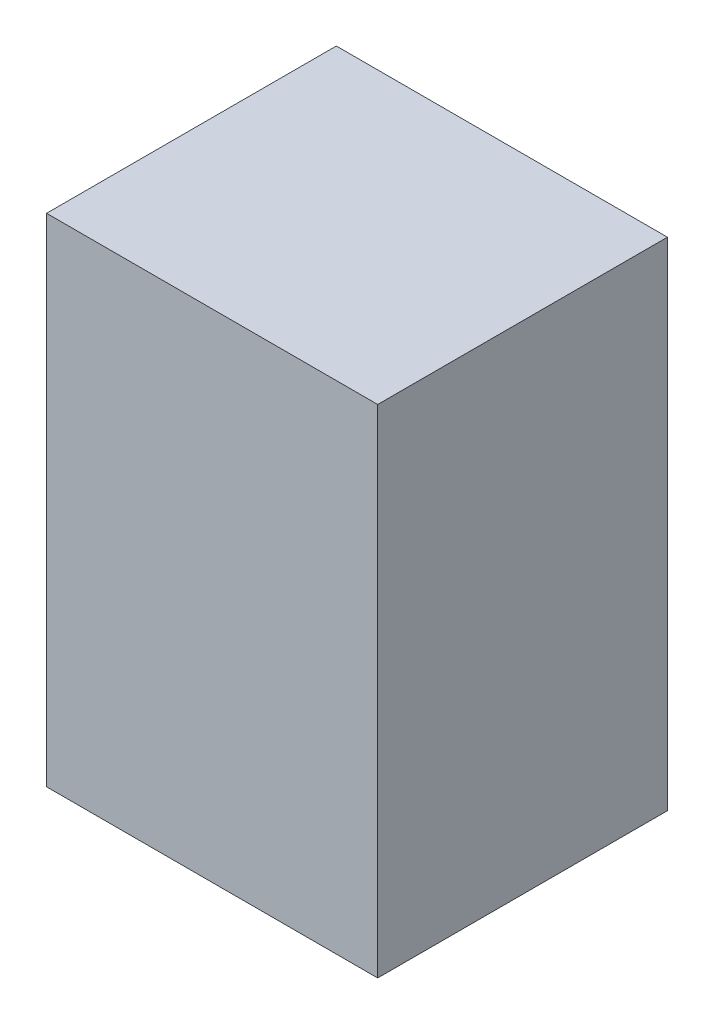
ISO-10303-21;
HEADER;
FILE_DESCRIPTION(('STEP AP214'),'2;1');
FILE_NAME('part.step','',(''),(''),'','','');
FILE_SCHEMA(('AUTOMOTIVE_DESIGN { 1 0 10303 214 1 1 1 1 }'));
ENDSEC;
DATA;
#1=APPLICATION_CONTEXT('core data for automotive mechanical design processes');
#2=APPLICATION_PROTOCOL_DEFINITION('international standard','automotive_design',2000,#1);
#3=PRODUCT_CONTEXT('',#1,'mechanical');
#4=PRODUCT('Part','Part','',(#3));
#5=PRODUCT_RELATED_PRODUCT_CATEGORY('part','',(#4));
#6=PRODUCT_DEFINITION_FORMATION('','',#4);
#7=PRODUCT_DEFINITION_CONTEXT('part definition',#1,'design');
#8=PRODUCT_DEFINITION('design','',#6,#7);
#9=PRODUCT_DEFINITION_SHAPE('','',#8);
#10=(LENGTH_UNIT() NAMED_UNIT(*) SI_UNIT(.MILLI.,.METRE.));
#11=(NAMED_UNIT(*) PLANE_ANGLE_UNIT() SI_UNIT($,.RADIAN.));
#12=(NAMED_UNIT(*) SI_UNIT($,.STERADIAN.) SOLID_ANGLE_UNIT());
#13=UNCERTAINTY_MEASURE_WITH_UNIT(LENGTH_MEASURE(1.E-05),#10,'distance_accuracy_value','');
#14=(GEOMETRIC_REPRESENTATION_CONTEXT(3) GLOBAL_UNCERTAINTY_ASSIGNED_CONTEXT((#13)) GLOBAL_UNIT_ASSIGNED_CONTEXT((#10,
#11,#12)) REPRESENTATION_CONTEXT('',''));
#15=CARTESIAN_POINT('',(0.,0.,0.));
#16=DIRECTION('',(0.,0.,1.));
#17=DIRECTION('',(1.,0.,0.));
#18=AXIS2_PLACEMENT_3D('',#15,#16,#17);
#19=CARTESIAN_POINT('',(-14.00000066,3.99999934,-1.611602167724));
#20=DIRECTION('',(0.,0.,1.));
#21=DIRECTION('',(1.,0.,0.));
#22=AXIS2_PLACEMENT_3D('',#19,#20,#21);
#23=PLANE('',#22);
#24=DIRECTION('',(0.,1.,0.));
#25=VECTOR('',#24,1.);
#26=CARTESIAN_POINT('',(-14.39999986,4.59999814,-1.611602167724));
#27=LINE('',#26,#25);
#28=CARTESIAN_POINT('',(-14.39999986,4.59999814,-1.611602167724));
#29=VERTEX_POINT('',#28);
#30=CARTESIAN_POINT('',(-14.39999986,3.40000054,-1.611602167724));
#31=VERTEX_POINT('',#30);
#32=EDGE_CURVE('E76',#29,#31,#27,.F.);
#33=ORIENTED_EDGE('',*,*,#32,.T.);
#34=DIRECTION('',(1.,0.,0.));
#35=VECTOR('',#34,1.);
#36=CARTESIAN_POINT('',(-14.39999986,3.40000054,-1.611602167724));
#37=LINE('',#36,#35);
#38=CARTESIAN_POINT('',(-13.60000146,3.40000054,-1.611602167724));
#39=VERTEX_POINT('',#38);
#40=EDGE_CURVE('E58',#31,#39,#37,.T.);
#41=ORIENTED_EDGE('',*,*,#40,.T.);
#42=DIRECTION('',(0.,1.,0.));
#43=VECTOR('',#42,1.);
#44=CARTESIAN_POINT('',(-13.60000146,3.40000054,-1.611602167724));
#45=LINE('',#44,#43);
#46=CARTESIAN_POINT('',(-13.60000146,4.59999814,-1.611602167724));
#47=VERTEX_POINT('',#46);
#48=EDGE_CURVE('E20',#39,#47,#45,.T.);
#49=ORIENTED_EDGE('',*,*,#48,.T.);
#50=DIRECTION('',(1.,0.,0.));
#51=VECTOR('',#50,1.);
#52=CARTESIAN_POINT('',(-13.60000146,4.59999814,-1.611602167724));
#53=LINE('',#52,#51);
#54=EDGE_CURVE('E55',#47,#29,#53,.F.);
#55=ORIENTED_EDGE('',*,*,#54,.T.);
#56=EDGE_LOOP('',(#33,#41,#49,#55));
#57=FACE_BOUND('',#56,.T.);
#58=ADVANCED_FACE('F17',(#57),#23,.T.);
#59=CARTESIAN_POINT('',(-13.60000146,3.40000054,-2.311603307724));
#60=DIRECTION('',(-1.,0.,0.));
#61=DIRECTION('',(0.,0.,1.));
#62=AXIS2_PLACEMENT_3D('',#59,#60,#61);
#63=PLANE('',#62);
#64=DIRECTION('',(0.,0.,-1.));
#65=VECTOR('',#64,1.);
#66=CARTESIAN_POINT('',(-13.60000146,4.59999814,-2.311603307724));
#67=LINE('',#66,#65);
#68=CARTESIAN_POINT('',(-13.60000146,4.59999814,-2.311603307724));
#69=VERTEX_POINT('',#68);
#70=EDGE_CURVE('E63',#69,#47,#67,.F.);
#71=ORIENTED_EDGE('',*,*,#70,.T.);
#72=ORIENTED_EDGE('',*,*,#48,.F.);
#73=DIRECTION('',(0.,0.,1.));
#74=VECTOR('',#73,1.);
#75=CARTESIAN_POINT('',(-13.60000146,3.40000054,-2.311603307724));
#76=LINE('',#75,#74);
#77=CARTESIAN_POINT('',(-13.60000146,3.40000054,-2.311603307724));
#78=VERTEX_POINT('',#77);
#79=EDGE_CURVE('E80',#39,#78,#76,.F.);
#80=ORIENTED_EDGE('',*,*,#79,.T.);
#81=DIRECTION('',(0.,1.,0.));
#82=VECTOR('',#81,1.);
#83=CARTESIAN_POINT('',(-13.60000146,3.99999934,-2.311603307724));
#84=LINE('',#83,#82);
#85=EDGE_CURVE('E73',#78,#69,#84,.T.);
#86=ORIENTED_EDGE('',*,*,#85,.T.);
#87=EDGE_LOOP('',(#71,#72,#80,#86));
#88=FACE_BOUND('',#87,.T.);
#89=ADVANCED_FACE('F72',(#88),#63,.F.);
#90=CARTESIAN_POINT('',(-13.60000146,4.59999814,-2.311603307724));
#91=DIRECTION('',(0.,-1.,0.));
#92=DIRECTION('',(0.,0.,-1.));
#93=AXIS2_PLACEMENT_3D('',#90,#91,#92);
#94=PLANE('',#93);
#95=DIRECTION('',(0.,0.,-1.));
#96=VECTOR('',#95,1.);
#97=CARTESIAN_POINT('',(-14.39999986,4.59999814,-2.311603307724));
#98=LINE('',#97,#96);
#99=CARTESIAN_POINT('',(-14.39999986,4.59999814,-2.311603307724));
#100=VERTEX_POINT('',#99);
#101=EDGE_CURVE('E69',#100,#29,#98,.F.);
#102=ORIENTED_EDGE('',*,*,#101,.T.);
#103=ORIENTED_EDGE('',*,*,#54,.F.);
#104=ORIENTED_EDGE('',*,*,#70,.F.);
#105=DIRECTION('',(1.,0.,0.));
#106=VECTOR('',#105,1.);
#107=CARTESIAN_POINT('',(-14.00000066,4.59999814,-2.311603307724));
#108=LINE('',#107,#106);
#109=EDGE_CURVE('E83',#69,#100,#108,.F.);
#110=ORIENTED_EDGE('',*,*,#109,.T.);
#111=EDGE_LOOP('',(#102,#103,#104,#110));
#112=FACE_BOUND('',#111,.T.);
#113=ADVANCED_FACE('F66',(#112),#94,.F.);
#114=CARTESIAN_POINT('',(-14.39999986,4.59999814,-2.311603307724));
#115=DIRECTION('',(1.,0.,0.));
#116=DIRECTION('',(0.,0.,-1.));
#117=AXIS2_PLACEMENT_3D('',#114,#115,#116);
#118=PLANE('',#117);
#119=DIRECTION('',(0.,0.,1.));
#120=VECTOR('',#119,1.);
#121=CARTESIAN_POINT('',(-14.39999986,3.40000054,-2.311603307724));
#122=LINE('',#121,#120);
#123=CARTESIAN_POINT('',(-14.39999986,3.40000054,-2.311603307724));
#124=VERTEX_POINT('',#123);
#125=EDGE_CURVE('E34',#124,#31,#122,.T.);
#126=ORIENTED_EDGE('',*,*,#125,.T.);
#127=ORIENTED_EDGE('',*,*,#32,.F.);
#128=ORIENTED_EDGE('',*,*,#101,.F.);
#129=DIRECTION('',(0.,1.,0.));
#130=VECTOR('',#129,1.);
#131=CARTESIAN_POINT('',(-14.39999986,3.99999934,-2.311603307724));
#132=LINE('',#131,#130);
#133=EDGE_CURVE('E26',#100,#124,#132,.F.);
#134=ORIENTED_EDGE('',*,*,#133,.T.);
#135=EDGE_LOOP('',(#126,#127,#128,#134));
#136=FACE_BOUND('',#135,.T.);
#137=ADVANCED_FACE('F88',(#136),#118,.F.);
#138=CARTESIAN_POINT('',(-14.39999986,3.40000054,-2.311603307724));
#139=DIRECTION('',(0.,1.,0.));
#140=DIRECTION('',(0.,0.,1.));
#141=AXIS2_PLACEMENT_3D('',#138,#139,#140);
#142=PLANE('',#141);
#143=ORIENTED_EDGE('',*,*,#79,.F.);
#144=ORIENTED_EDGE('',*,*,#40,.F.);
#145=ORIENTED_EDGE('',*,*,#125,.F.);
#146=DIRECTION('',(1.,0.,0.));
#147=VECTOR('',#146,1.);
#148=CARTESIAN_POINT('',(-14.00000066,3.40000054,-2.311603307724));
#149=LINE('',#148,#147);
#150=EDGE_CURVE('E11',#124,#78,#149,.T.);
#151=ORIENTED_EDGE('',*,*,#150,.T.);
#152=EDGE_LOOP('',(#143,#144,#145,#151));
#153=FACE_BOUND('',#152,.T.);
#154=ADVANCED_FACE('F91',(#153),#142,.F.);
#155=CARTESIAN_POINT('',(-14.00000066,3.99999934,-2.311603307724));
#156=DIRECTION('',(0.,0.,1.));
#157=DIRECTION('',(1.,0.,0.));
#158=AXIS2_PLACEMENT_3D('',#155,#156,#157);
#159=PLANE('',#158);
#160=ORIENTED_EDGE('',*,*,#133,.F.);
#161=ORIENTED_EDGE('',*,*,#109,.F.);
#162=ORIENTED_EDGE('',*,*,#85,.F.);
#163=ORIENTED_EDGE('',*,*,#150,.F.);
#164=EDGE_LOOP('',(#160,#161,#162,#163));
#165=FACE_BOUND('',#164,.T.);
#166=ADVANCED_FACE('F90',(#165),#159,.F.);
#167=CLOSED_SHELL('',(#58,#89,#113,#137,#154,#166));
#168=MANIFOLD_SOLID_BREP('B1',#167);
#169=ADVANCED_BREP_SHAPE_REPRESENTATION('',(#18,#168),#14);
#170=SHAPE_DEFINITION_REPRESENTATION(#9,#169);
ENDSEC;
END-ISO-10303-21;
